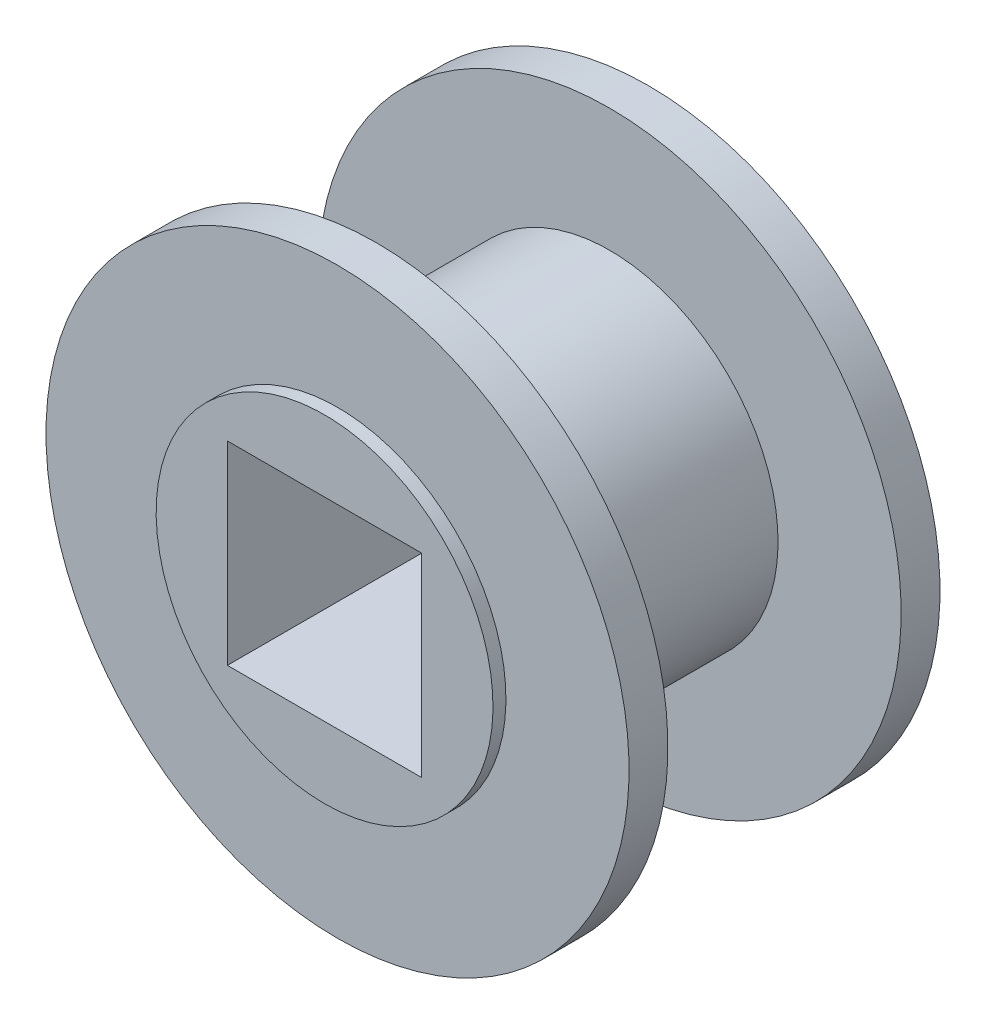
ISO-10303-21;
HEADER;
FILE_DESCRIPTION(('STEP AP214'),'2;1');
FILE_NAME('part.step','',(''),(''),'','','');
FILE_SCHEMA(('AUTOMOTIVE_DESIGN { 1 0 10303 214 1 1 1 1 }'));
ENDSEC;
DATA;
#1=APPLICATION_CONTEXT('core data for automotive mechanical design processes');
#2=APPLICATION_PROTOCOL_DEFINITION('international standard','automotive_design',2000,#1);
#3=PRODUCT_CONTEXT('',#1,'mechanical');
#4=PRODUCT('Part','Part','',(#3));
#5=PRODUCT_RELATED_PRODUCT_CATEGORY('part','',(#4));
#6=PRODUCT_DEFINITION_FORMATION('','',#4);
#7=PRODUCT_DEFINITION_CONTEXT('part definition',#1,'design');
#8=PRODUCT_DEFINITION('design','',#6,#7);
#9=PRODUCT_DEFINITION_SHAPE('','',#8);
#10=(LENGTH_UNIT() NAMED_UNIT(*) SI_UNIT(.MILLI.,.METRE.));
#11=(NAMED_UNIT(*) PLANE_ANGLE_UNIT() SI_UNIT($,.RADIAN.));
#12=(NAMED_UNIT(*) SI_UNIT($,.STERADIAN.) SOLID_ANGLE_UNIT());
#13=UNCERTAINTY_MEASURE_WITH_UNIT(LENGTH_MEASURE(1.E-05),#10,'distance_accuracy_value','');
#14=(GEOMETRIC_REPRESENTATION_CONTEXT(3) GLOBAL_UNCERTAINTY_ASSIGNED_CONTEXT((#13)) GLOBAL_UNIT_ASSIGNED_CONTEXT((#10,
#11,#12)) REPRESENTATION_CONTEXT('',''));
#15=CARTESIAN_POINT('',(0.,0.,0.));
#16=DIRECTION('',(0.,0.,1.));
#17=DIRECTION('',(1.,0.,0.));
#18=AXIS2_PLACEMENT_3D('',#15,#16,#17);
#19=CARTESIAN_POINT('',(0.,0.,13.));
#20=DIRECTION('',(0.,0.,-1.));
#21=DIRECTION('',(0.,1.,0.));
#22=AXIS2_PLACEMENT_3D('',#19,#20,#21);
#23=PLANE('',#22);
#24=DIRECTION('',(-1.,0.,0.));
#25=VECTOR('',#24,1.);
#26=CARTESIAN_POINT('',(-7.5,7.5,13.));
#27=LINE('',#26,#25);
#28=CARTESIAN_POINT('',(7.5,7.5,13.));
#29=VERTEX_POINT('',#28);
#30=CARTESIAN_POINT('',(-7.5,7.5,13.));
#31=VERTEX_POINT('',#30);
#32=EDGE_CURVE('E121',#29,#31,#27,.T.);
#33=ORIENTED_EDGE('',*,*,#32,.F.);
#34=DIRECTION('',(0.,1.,0.));
#35=VECTOR('',#34,1.);
#36=CARTESIAN_POINT('',(7.5,-7.5,13.));
#37=LINE('',#36,#35);
#38=CARTESIAN_POINT('',(7.5,-7.5,13.));
#39=VERTEX_POINT('',#38);
#40=EDGE_CURVE('E53',#39,#29,#37,.T.);
#41=ORIENTED_EDGE('',*,*,#40,.F.);
#42=DIRECTION('',(1.,0.,0.));
#43=VECTOR('',#42,1.);
#44=CARTESIAN_POINT('',(-7.5,-7.5,13.));
#45=LINE('',#44,#43);
#46=CARTESIAN_POINT('',(-7.5,-7.5,13.));
#47=VERTEX_POINT('',#46);
#48=EDGE_CURVE('E100',#47,#39,#45,.T.);
#49=ORIENTED_EDGE('',*,*,#48,.F.);
#50=DIRECTION('',(0.,-1.,0.));
#51=VECTOR('',#50,1.);
#52=CARTESIAN_POINT('',(-7.5,-7.5,13.));
#53=LINE('',#52,#51);
#54=EDGE_CURVE('E104',#31,#47,#53,.T.);
#55=ORIENTED_EDGE('',*,*,#54,.F.);
#56=EDGE_LOOP('',(#33,#41,#49,#55));
#57=FACE_BOUND('',#56,.T.);
#58=CARTESIAN_POINT('',(0.,0.,13.));
#59=DIRECTION('',(0.,0.,1.));
#60=DIRECTION('',(0.,-1.,0.));
#61=AXIS2_PLACEMENT_3D('',#58,#59,#60);
#62=CIRCLE('',#61,13.);
#63=CARTESIAN_POINT('',(0.,-13.,13.));
#64=VERTEX_POINT('',#63);
#65=EDGE_CURVE('E11',#64,#64,#62,.T.);
#66=ORIENTED_EDGE('',*,*,#65,.T.);
#67=EDGE_LOOP('',(#66));
#68=FACE_BOUND('',#67,.T.);
#69=ADVANCED_FACE('F38',(#57,#68),#23,.F.);
#70=CARTESIAN_POINT('',(0.,0.,19.5817610062893));
#71=DIRECTION('',(0.,0.,1.));
#72=DIRECTION('',(0.,-1.,0.));
#73=AXIS2_PLACEMENT_3D('',#70,#71,#72);
#74=CYLINDRICAL_SURFACE('',#73,13.);
#75=ORIENTED_EDGE('',*,*,#65,.F.);
#76=EDGE_LOOP('',(#75));
#77=FACE_BOUND('',#76,.T.);
#78=CARTESIAN_POINT('',(0.,0.,12.));
#79=DIRECTION('',(0.,0.,1.));
#80=DIRECTION('',(0.,-1.,0.));
#81=AXIS2_PLACEMENT_3D('',#78,#79,#80);
#82=CIRCLE('',#81,13.);
#83=CARTESIAN_POINT('',(0.,-13.,12.));
#84=VERTEX_POINT('',#83);
#85=EDGE_CURVE('E46',#84,#84,#82,.T.);
#86=ORIENTED_EDGE('',*,*,#85,.T.);
#87=EDGE_LOOP('',(#86));
#88=FACE_BOUND('',#87,.T.);
#89=ADVANCED_FACE('F170',(#77,#88),#74,.T.);
#90=CARTESIAN_POINT('',(0.,13.,12.));
#91=DIRECTION('',(0.,0.,-1.));
#92=DIRECTION('',(0.,1.,0.));
#93=AXIS2_PLACEMENT_3D('',#90,#91,#92);
#94=PLANE('',#93);
#95=ORIENTED_EDGE('',*,*,#85,.F.);
#96=EDGE_LOOP('',(#95));
#97=FACE_BOUND('',#96,.T.);
#98=CARTESIAN_POINT('',(0.,0.,12.));
#99=DIRECTION('',(0.,0.,1.));
#100=DIRECTION('',(0.,-1.,0.));
#101=AXIS2_PLACEMENT_3D('',#98,#99,#100);
#102=CIRCLE('',#101,22.5);
#103=CARTESIAN_POINT('',(0.,-22.5,12.));
#104=VERTEX_POINT('',#103);
#105=EDGE_CURVE('E163',#104,#104,#102,.T.);
#106=ORIENTED_EDGE('',*,*,#105,.T.);
#107=EDGE_LOOP('',(#106));
#108=FACE_BOUND('',#107,.T.);
#109=ADVANCED_FACE('F172',(#97,#108),#94,.F.);
#110=CARTESIAN_POINT('',(0.,0.,19.5817610062893));
#111=DIRECTION('',(0.,0.,1.));
#112=DIRECTION('',(0.,-1.,0.));
#113=AXIS2_PLACEMENT_3D('',#110,#111,#112);
#114=CYLINDRICAL_SURFACE('',#113,22.5);
#115=ORIENTED_EDGE('',*,*,#105,.F.);
#116=EDGE_LOOP('',(#115));
#117=FACE_BOUND('',#116,.T.);
#118=CARTESIAN_POINT('',(0.,0.,9.));
#119=DIRECTION('',(0.,0.,1.));
#120=DIRECTION('',(0.,-1.,0.));
#121=AXIS2_PLACEMENT_3D('',#118,#119,#120);
#122=CIRCLE('',#121,22.5);
#123=CARTESIAN_POINT('',(0.,-22.5,8.99999999999999));
#124=VERTEX_POINT('',#123);
#125=EDGE_CURVE('E159',#124,#124,#122,.T.);
#126=ORIENTED_EDGE('',*,*,#125,.T.);
#127=EDGE_LOOP('',(#126));
#128=FACE_BOUND('',#127,.T.);
#129=ADVANCED_FACE('F175',(#117,#128),#114,.T.);
#130=CARTESIAN_POINT('',(0.,22.5,9.));
#131=DIRECTION('',(0.,0.,1.));
#132=DIRECTION('',(0.,-1.,0.));
#133=AXIS2_PLACEMENT_3D('',#130,#131,#132);
#134=PLANE('',#133);
#135=ORIENTED_EDGE('',*,*,#125,.F.);
#136=EDGE_LOOP('',(#135));
#137=FACE_BOUND('',#136,.T.);
#138=CARTESIAN_POINT('',(0.,0.,9.));
#139=DIRECTION('',(0.,0.,1.));
#140=DIRECTION('',(0.,-1.,0.));
#141=AXIS2_PLACEMENT_3D('',#138,#139,#140);
#142=CIRCLE('',#141,13.);
#143=CARTESIAN_POINT('',(0.,-13.,9.));
#144=VERTEX_POINT('',#143);
#145=EDGE_CURVE('E155',#144,#144,#142,.T.);
#146=ORIENTED_EDGE('',*,*,#145,.T.);
#147=EDGE_LOOP('',(#146));
#148=FACE_BOUND('',#147,.T.);
#149=ADVANCED_FACE('F181',(#137,#148),#134,.F.);
#150=CARTESIAN_POINT('',(0.,0.,19.5817610062893));
#151=DIRECTION('',(0.,0.,1.));
#152=DIRECTION('',(0.,-1.,0.));
#153=AXIS2_PLACEMENT_3D('',#150,#151,#152);
#154=CYLINDRICAL_SURFACE('',#153,13.);
#155=CARTESIAN_POINT('',(-13.,0.,-8.5));
#156=CARTESIAN_POINT('',(-12.9999989044515,-0.0839563147427421,-8.49999640316709));
#157=CARTESIAN_POINT('',(-12.999178081572,-0.167966345196187,-8.49292758496519));
#158=CARTESIAN_POINT('',(-12.995982599614,-0.333652235419372,-8.46483826496662));
#159=CARTESIAN_POINT('',(-12.9936062813601,-0.415325505475653,-8.44380286531638));
#160=CARTESIAN_POINT('',(-12.9875677351869,-0.573914972249221,-8.38840533385724));
#161=CARTESIAN_POINT('',(-12.9839063366207,-0.650834199520699,-8.35405179569065));
#162=CARTESIAN_POINT('',(-12.9757057473599,-0.79779979378714,-8.27301111812132));
#163=CARTESIAN_POINT('',(-12.9711667170809,-0.867847413269117,-8.22632623210123));
#164=CARTESIAN_POINT('',(-12.9616943551208,-0.999427807179226,-8.12171196440117));
#165=CARTESIAN_POINT('',(-12.9567594432832,-1.06092347729183,-8.06373605262275));
#166=CARTESIAN_POINT('',(-12.9470643855765,-1.17333502414497,-7.93828516324756));
#167=CARTESIAN_POINT('',(-12.9423042482743,-1.2242503828419,-7.87080972079665));
#168=CARTESIAN_POINT('',(-12.9334819604022,-1.3141916873334,-7.72803733610484));
#169=CARTESIAN_POINT('',(-12.9294218388056,-1.3531833171573,-7.65271863992229));
#170=CARTESIAN_POINT('',(-12.9224797052987,-1.41795120910938,-7.49654783804118));
#171=CARTESIAN_POINT('',(-12.9195976551562,-1.44372790011126,-7.41569591201296));
#172=CARTESIAN_POINT('',(-12.9153528047108,-1.48122247723766,-7.25113647537628));
#173=CARTESIAN_POINT('',(-12.9139832786549,-1.49300261981048,-7.1674433262594));
#174=CARTESIAN_POINT('',(-12.9128978570991,-1.50236226854616,-6.99925756045587));
#175=CARTESIAN_POINT('',(-12.9131819045903,-1.49994226427626,-6.91476497143115));
#176=CARTESIAN_POINT('',(-12.9153653842397,-1.48102150197295,-6.7478106867289));
#177=CARTESIAN_POINT('',(-12.9172569773873,-1.46458907258954,-6.6653411304074));
#178=CARTESIAN_POINT('',(-12.9224301836669,-1.41821640637187,-6.50433810598175));
#179=CARTESIAN_POINT('',(-12.9257118211342,-1.38827593305336,-6.42580470681433));
#180=CARTESIAN_POINT('',(-12.9333043079058,-1.31566282618376,-6.2746895307639));
#181=CARTESIAN_POINT('',(-12.9376175732259,-1.27296024500285,-6.20212227049772));
#182=CARTESIAN_POINT('',(-12.9467853893456,-1.17605655290097,-6.06515827049275));
#183=CARTESIAN_POINT('',(-12.9516399612475,-1.12185499363063,-6.00076184949449));
#184=CARTESIAN_POINT('',(-12.9613782949516,-1.0031120359915,-5.88157071619168));
#185=CARTESIAN_POINT('',(-12.9662620604919,-0.938511694342139,-5.82683470870206));
#186=CARTESIAN_POINT('',(-12.9754816969276,-0.801008592236029,-5.72897438783242));
#187=CARTESIAN_POINT('',(-12.9798175668567,-0.728105817136098,-5.68585009493268));
#188=CARTESIAN_POINT('',(-12.9874550212078,-0.57602390567987,-5.61243828715518));
#189=CARTESIAN_POINT('',(-12.9907563324875,-0.496843118716625,-5.58215416157141));
#190=CARTESIAN_POINT('',(-12.9959501177405,-0.334473831095742,-5.5353274726576));
#191=CARTESIAN_POINT('',(-12.9978426478647,-0.251285490311374,-5.51878436163703));
#192=CARTESIAN_POINT('',(-12.999998373659,-0.0837704200050164,-5.49998472362037));
#193=CARTESIAN_POINT('',(-13.0002707984128,0.0005471135432015,-5.49764727106811));
#194=CARTESIAN_POINT('',(-12.9991804669134,0.168372695685007,-5.50711215461104));
#195=CARTESIAN_POINT('',(-12.9978177402298,0.251880758889224,-5.51891423501223));
#196=CARTESIAN_POINT('',(-12.993616027243,0.415480266956157,-5.556255972808));
#197=CARTESIAN_POINT('',(-12.9907811576039,0.495580568872891,-5.58175732870876));
#198=CARTESIAN_POINT('',(-12.9839527929212,0.650367161714355,-5.64573409622904));
#199=CARTESIAN_POINT('',(-12.9799592639147,0.725053293857113,-5.68420988816443));
#200=CARTESIAN_POINT('',(-12.9712363785455,0.867254744569763,-5.77324114512289));
#201=CARTESIAN_POINT('',(-12.9665038451426,0.934736878832463,-5.82384929591281));
#202=CARTESIAN_POINT('',(-12.9568430886348,1.06027784673838,-5.93563374481516));
#203=CARTESIAN_POINT('',(-12.9519148589511,1.11833636324618,-5.99681039844914));
#204=CARTESIAN_POINT('',(-12.9423899602444,1.22366664140003,-6.12835038533593));
#205=CARTESIAN_POINT('',(-12.9377950067669,1.27088497439797,-6.19875664350889));
#206=CARTESIAN_POINT('',(-12.9294843210235,1.35282617315314,-6.34654757584497));
#207=CARTESIAN_POINT('',(-12.9257685733744,1.38754925754463,-6.42393212787651));
#208=CARTESIAN_POINT('',(-12.9196483466479,1.44342658284102,-6.58330615373548));
#209=CARTESIAN_POINT('',(-12.91724089246,1.46461162925533,-6.66528470793035));
#210=CARTESIAN_POINT('',(-12.9140010380224,1.49291104062265,-6.83166493951436));
#211=CARTESIAN_POINT('',(-12.9131685761468,1.50002595610949,-6.91606652196452));
#212=CARTESIAN_POINT('',(-12.9131745631781,1.49997405326829,-7.08436565375942));
#213=CARTESIAN_POINT('',(-12.9140031925958,1.49289116482699,-7.16826324181099));
#214=CARTESIAN_POINT('',(-12.9172169582806,1.46482172327171,-7.33366750199321));
#215=CARTESIAN_POINT('',(-12.9196020954323,1.44383516225563,-7.41517417276497));
#216=CARTESIAN_POINT('',(-12.9256572251488,1.38857911797313,-7.57347609168934));
#217=CARTESIAN_POINT('',(-12.9293268880955,1.35431304208042,-7.65027254258118));
#218=CARTESIAN_POINT('',(-12.9375381901497,1.27347900341466,-7.79703840038788));
#219=CARTESIAN_POINT('',(-12.9420798337501,1.22691097725304,-7.86700777212214));
#220=CARTESIAN_POINT('',(-12.9515555600008,1.12248173071088,-7.99856295332931));
#221=CARTESIAN_POINT('',(-12.9564917239034,1.06455790771248,-8.06009892117498));
#222=CARTESIAN_POINT('',(-12.9661816355574,0.939190054186289,-8.17261111489076));
#223=CARTESIAN_POINT('',(-12.9709353397599,0.871743768617548,-8.22358483240876));
#224=CARTESIAN_POINT('',(-12.9797415177439,0.728996893197091,-8.31366356407028));
#225=CARTESIAN_POINT('',(-12.9837916526637,0.653671391511421,-8.35272930568544));
#226=CARTESIAN_POINT('',(-12.9907101076695,0.497527270565882,-8.41760310503945));
#227=CARTESIAN_POINT('',(-12.993579731148,0.416714824913398,-8.44342579213557));
#228=CARTESIAN_POINT('',(-12.9971099824635,0.279556305332048,-8.47479285483811));
#229=CARTESIAN_POINT('',(-12.9981885527758,0.22408031967996,-8.48423222713368));
#230=CARTESIAN_POINT('',(-12.9996339262189,0.112410914672187,-8.49683698528068));
#231=CARTESIAN_POINT('',(-13.0000007335839,0.0562174995863219,-8.50000240845436));
#232=CARTESIAN_POINT('',(-13.,0.,-8.5));
#233=B_SPLINE_CURVE_WITH_KNOTS('',3,(#155,#156,#157,#158,#159,#160,#161,#162,#163,#164,#165,
#166,#167,#168,#169,#170,#171,#172,#173,#174,#175,#176,#177,#178,#179,#180,#181,#182,#183,#184,
#185,#186,#187,#188,#189,#190,#191,#192,#193,#194,#195,#196,#197,#198,#199,#200,#201,#202,#203,
#204,#205,#206,#207,#208,#209,#210,#211,#212,#213,#214,#215,#216,#217,#218,#219,#220,#221,#222,
#223,#224,#225,#226,#227,#228,#229,#230,#231,#232),.UNSPECIFIED.,.T.,.F.,(4,2,2,2,2,2,2,2,2,2,2,
2,2,2,2,2,2,2,2,2,2,2,2,2,2,2,2,2,2,2,2,2,2,2,2,2,2,2,4),(0.,0.251663624421978,
0.503596125244171,0.755366334321089,1.00709056767771,1.25987498270023,1.51267177188699,
1.76618939688668,2.0196987937799,2.27207631201581,2.52444512928255,2.77559031440111,
3.02673989646913,3.27848351780672,3.53023695652505,3.78347119880911,4.0367058877347,
4.29000737900445,4.54329877367693,4.79514587715501,5.04698842639316,5.29813049175019,
5.54927991940194,5.80154039645154,6.05380936112788,6.30729621090899,6.56077862511548,
6.81368217226278,7.0665758236448,7.31797891068329,7.56938214060554,7.82072090595902,
8.07206096641734,8.32482769676521,8.57765438622356,8.83130609524227,9.08467699305618,
9.2531930112789,9.42170802703664),.UNSPECIFIED.);
#234=CARTESIAN_POINT('',(-13.,0.,-8.5));
#235=VERTEX_POINT('',#234);
#236=EDGE_CURVE('E107',#235,#235,#233,.T.);
#237=ORIENTED_EDGE('',*,*,#236,.F.);
#238=EDGE_LOOP('',(#237));
#239=FACE_BOUND('',#238,.T.);
#240=ORIENTED_EDGE('',*,*,#145,.F.);
#241=EDGE_LOOP('',(#240));
#242=FACE_BOUND('',#241,.T.);
#243=CARTESIAN_POINT('',(0.,0.,-9.));
#244=DIRECTION('',(0.,0.,1.));
#245=DIRECTION('',(0.,-1.,0.));
#246=AXIS2_PLACEMENT_3D('',#243,#244,#245);
#247=CIRCLE('',#246,13.);
#248=CARTESIAN_POINT('',(0.,-13.,-9.));
#249=VERTEX_POINT('',#248);
#250=EDGE_CURVE('E151',#249,#249,#247,.T.);
#251=ORIENTED_EDGE('',*,*,#250,.T.);
#252=EDGE_LOOP('',(#251));
#253=FACE_BOUND('',#252,.T.);
#254=ADVANCED_FACE('F187',(#239,#242,#253),#154,.T.);
#255=CARTESIAN_POINT('',(0.,13.,-9.));
#256=DIRECTION('',(0.,0.,-1.));
#257=DIRECTION('',(0.,1.,0.));
#258=AXIS2_PLACEMENT_3D('',#255,#256,#257);
#259=PLANE('',#258);
#260=ORIENTED_EDGE('',*,*,#250,.F.);
#261=EDGE_LOOP('',(#260));
#262=FACE_BOUND('',#261,.T.);
#263=CARTESIAN_POINT('',(0.,0.,-9.00000000000001));
#264=DIRECTION('',(0.,0.,1.));
#265=DIRECTION('',(0.,-1.,0.));
#266=AXIS2_PLACEMENT_3D('',#263,#264,#265);
#267=CIRCLE('',#266,22.5);
#268=CARTESIAN_POINT('',(0.,-22.5,-9.00000000000001));
#269=VERTEX_POINT('',#268);
#270=EDGE_CURVE('E147',#269,#269,#267,.T.);
#271=ORIENTED_EDGE('',*,*,#270,.T.);
#272=EDGE_LOOP('',(#271));
#273=FACE_BOUND('',#272,.T.);
#274=ADVANCED_FACE('F193',(#262,#273),#259,.F.);
#275=CARTESIAN_POINT('',(0.,0.,19.5817610062893));
#276=DIRECTION('',(0.,0.,1.));
#277=DIRECTION('',(0.,-1.,0.));
#278=AXIS2_PLACEMENT_3D('',#275,#276,#277);
#279=CYLINDRICAL_SURFACE('',#278,22.5);
#280=ORIENTED_EDGE('',*,*,#270,.F.);
#281=EDGE_LOOP('',(#280));
#282=FACE_BOUND('',#281,.T.);
#283=CARTESIAN_POINT('',(0.,0.,-12.));
#284=DIRECTION('',(0.,0.,1.));
#285=DIRECTION('',(0.,-1.,0.));
#286=AXIS2_PLACEMENT_3D('',#283,#284,#285);
#287=CIRCLE('',#286,22.5);
#288=CARTESIAN_POINT('',(0.,-22.5,-12.));
#289=VERTEX_POINT('',#288);
#290=EDGE_CURVE('E143',#289,#289,#287,.T.);
#291=ORIENTED_EDGE('',*,*,#290,.T.);
#292=EDGE_LOOP('',(#291));
#293=FACE_BOUND('',#292,.T.);
#294=ADVANCED_FACE('F200',(#282,#293),#279,.T.);
#295=CARTESIAN_POINT('',(0.,22.5,-12.));
#296=DIRECTION('',(0.,0.,1.));
#297=DIRECTION('',(0.,-1.,0.));
#298=AXIS2_PLACEMENT_3D('',#295,#296,#297);
#299=PLANE('',#298);
#300=ORIENTED_EDGE('',*,*,#290,.F.);
#301=EDGE_LOOP('',(#300));
#302=FACE_BOUND('',#301,.T.);
#303=CARTESIAN_POINT('',(0.,0.,-12.));
#304=DIRECTION('',(0.,0.,1.));
#305=DIRECTION('',(0.,-1.,0.));
#306=AXIS2_PLACEMENT_3D('',#303,#304,#305);
#307=CIRCLE('',#306,13.);
#308=CARTESIAN_POINT('',(0.,-13.,-12.));
#309=VERTEX_POINT('',#308);
#310=EDGE_CURVE('E139',#309,#309,#307,.T.);
#311=ORIENTED_EDGE('',*,*,#310,.T.);
#312=EDGE_LOOP('',(#311));
#313=FACE_BOUND('',#312,.T.);
#314=ADVANCED_FACE('F206',(#302,#313),#299,.F.);
#315=CARTESIAN_POINT('',(0.,0.,19.5817610062893));
#316=DIRECTION('',(0.,0.,1.));
#317=DIRECTION('',(0.,-1.,0.));
#318=AXIS2_PLACEMENT_3D('',#315,#316,#317);
#319=CYLINDRICAL_SURFACE('',#318,13.);
#320=ORIENTED_EDGE('',*,*,#310,.F.);
#321=EDGE_LOOP('',(#320));
#322=FACE_BOUND('',#321,.T.);
#323=CARTESIAN_POINT('',(0.,0.,-13.));
#324=DIRECTION('',(0.,0.,1.));
#325=DIRECTION('',(0.,-1.,0.));
#326=AXIS2_PLACEMENT_3D('',#323,#324,#325);
#327=CIRCLE('',#326,13.);
#328=CARTESIAN_POINT('',(0.,-13.,-13.));
#329=VERTEX_POINT('',#328);
#330=EDGE_CURVE('E130',#329,#329,#327,.T.);
#331=ORIENTED_EDGE('',*,*,#330,.T.);
#332=EDGE_LOOP('',(#331));
#333=FACE_BOUND('',#332,.T.);
#334=ADVANCED_FACE('F212',(#322,#333),#319,.T.);
#335=CARTESIAN_POINT('',(0.,13.,-13.));
#336=DIRECTION('',(0.,0.,1.));
#337=DIRECTION('',(0.,-1.,0.));
#338=AXIS2_PLACEMENT_3D('',#335,#336,#337);
#339=PLANE('',#338);
#340=DIRECTION('',(1.,0.,0.));
#341=VECTOR('',#340,1.);
#342=CARTESIAN_POINT('',(-7.5,-7.5,-13.));
#343=LINE('',#342,#341);
#344=CARTESIAN_POINT('',(-7.5,-7.5,-13.));
#345=VERTEX_POINT('',#344);
#346=CARTESIAN_POINT('',(7.5,-7.5,-13.));
#347=VERTEX_POINT('',#346);
#348=EDGE_CURVE('E88',#345,#347,#343,.T.);
#349=ORIENTED_EDGE('',*,*,#348,.T.);
#350=DIRECTION('',(0.,1.,0.));
#351=VECTOR('',#350,1.);
#352=CARTESIAN_POINT('',(7.5,-7.5,-13.));
#353=LINE('',#352,#351);
#354=CARTESIAN_POINT('',(7.5,7.5,-13.));
#355=VERTEX_POINT('',#354);
#356=EDGE_CURVE('E81',#347,#355,#353,.T.);
#357=ORIENTED_EDGE('',*,*,#356,.T.);
#358=DIRECTION('',(-1.,0.,0.));
#359=VECTOR('',#358,1.);
#360=CARTESIAN_POINT('',(-7.5,7.5,-13.));
#361=LINE('',#360,#359);
#362=CARTESIAN_POINT('',(-7.5,7.5,-13.));
#363=VERTEX_POINT('',#362);
#364=EDGE_CURVE('E91',#355,#363,#361,.T.);
#365=ORIENTED_EDGE('',*,*,#364,.T.);
#366=DIRECTION('',(0.,-1.,0.));
#367=VECTOR('',#366,1.);
#368=CARTESIAN_POINT('',(-7.5,-7.5,-13.));
#369=LINE('',#368,#367);
#370=EDGE_CURVE('E61',#363,#345,#369,.T.);
#371=ORIENTED_EDGE('',*,*,#370,.T.);
#372=EDGE_LOOP('',(#349,#357,#365,#371));
#373=FACE_BOUND('',#372,.T.);
#374=ORIENTED_EDGE('',*,*,#330,.F.);
#375=EDGE_LOOP('',(#374));
#376=FACE_BOUND('',#375,.T.);
#377=ADVANCED_FACE('F96',(#373,#376),#339,.F.);
#378=CARTESIAN_POINT('',(7.5,-7.5,-13.));
#379=DIRECTION('',(1.,0.,0.));
#380=DIRECTION('',(0.,0.,-1.));
#381=AXIS2_PLACEMENT_3D('',#378,#379,#380);
#382=PLANE('',#381);
#383=ORIENTED_EDGE('',*,*,#40,.T.);
#384=DIRECTION('',(0.,0.,1.));
#385=VECTOR('',#384,1.);
#386=CARTESIAN_POINT('',(7.5,7.5,-13.));
#387=LINE('',#386,#385);
#388=EDGE_CURVE('E77',#355,#29,#387,.T.);
#389=ORIENTED_EDGE('',*,*,#388,.F.);
#390=ORIENTED_EDGE('',*,*,#356,.F.);
#391=DIRECTION('',(0.,0.,1.));
#392=VECTOR('',#391,1.);
#393=CARTESIAN_POINT('',(7.5,-7.5,-13.));
#394=LINE('',#393,#392);
#395=EDGE_CURVE('E127',#347,#39,#394,.T.);
#396=ORIENTED_EDGE('',*,*,#395,.T.);
#397=EDGE_LOOP('',(#383,#389,#390,#396));
#398=FACE_BOUND('',#397,.T.);
#399=ADVANCED_FACE('F79',(#398),#382,.F.);
#400=CARTESIAN_POINT('',(-7.5,-7.5,-13.));
#401=DIRECTION('',(0.,-1.,0.));
#402=DIRECTION('',(0.,0.,-1.));
#403=AXIS2_PLACEMENT_3D('',#400,#401,#402);
#404=PLANE('',#403);
#405=ORIENTED_EDGE('',*,*,#48,.T.);
#406=ORIENTED_EDGE('',*,*,#395,.F.);
#407=ORIENTED_EDGE('',*,*,#348,.F.);
#408=DIRECTION('',(0.,0.,1.));
#409=VECTOR('',#408,1.);
#410=CARTESIAN_POINT('',(-7.5,-7.5,-13.));
#411=LINE('',#410,#409);
#412=EDGE_CURVE('E131',#345,#47,#411,.T.);
#413=ORIENTED_EDGE('',*,*,#412,.T.);
#414=EDGE_LOOP('',(#405,#406,#407,#413));
#415=FACE_BOUND('',#414,.T.);
#416=ADVANCED_FACE('F225',(#415),#404,.F.);
#417=CARTESIAN_POINT('',(-7.5,-7.5,-13.));
#418=DIRECTION('',(-1.,0.,0.));
#419=DIRECTION('',(0.,0.,1.));
#420=AXIS2_PLACEMENT_3D('',#417,#418,#419);
#421=PLANE('',#420);
#422=CARTESIAN_POINT('',(-7.5,0.,-7.));
#423=DIRECTION('',(-1.,0.,0.));
#424=DIRECTION('',(0.,0.,1.));
#425=AXIS2_PLACEMENT_3D('',#422,#423,#424);
#426=CIRCLE('',#425,1.5);
#427=CARTESIAN_POINT('',(-7.5,0.,-5.5));
#428=VERTEX_POINT('',#427);
#429=EDGE_CURVE('E260',#428,#428,#426,.F.);
#430=ORIENTED_EDGE('',*,*,#429,.F.);
#431=EDGE_LOOP('',(#430));
#432=FACE_BOUND('',#431,.T.);
#433=ORIENTED_EDGE('',*,*,#54,.T.);
#434=ORIENTED_EDGE('',*,*,#412,.F.);
#435=ORIENTED_EDGE('',*,*,#370,.F.);
#436=DIRECTION('',(0.,0.,1.));
#437=VECTOR('',#436,1.);
#438=CARTESIAN_POINT('',(-7.5,7.5,-13.));
#439=LINE('',#438,#437);
#440=EDGE_CURVE('E87',#363,#31,#439,.T.);
#441=ORIENTED_EDGE('',*,*,#440,.T.);
#442=EDGE_LOOP('',(#433,#434,#435,#441));
#443=FACE_BOUND('',#442,.T.);
#444=ADVANCED_FACE('F237',(#432,#443),#421,.F.);
#445=CARTESIAN_POINT('',(-7.5,7.5,-13.));
#446=DIRECTION('',(0.,1.,0.));
#447=DIRECTION('',(0.,0.,1.));
#448=AXIS2_PLACEMENT_3D('',#445,#446,#447);
#449=PLANE('',#448);
#450=ORIENTED_EDGE('',*,*,#32,.T.);
#451=ORIENTED_EDGE('',*,*,#440,.F.);
#452=ORIENTED_EDGE('',*,*,#364,.F.);
#453=ORIENTED_EDGE('',*,*,#388,.T.);
#454=EDGE_LOOP('',(#450,#451,#452,#453));
#455=FACE_BOUND('',#454,.T.);
#456=ADVANCED_FACE('F92',(#455),#449,.F.);
#457=CARTESIAN_POINT('',(-22.501,0.,-7.));
#458=DIRECTION('',(1.,0.,0.));
#459=DIRECTION('',(0.,0.,-1.));
#460=AXIS2_PLACEMENT_3D('',#457,#458,#459);
#461=CYLINDRICAL_SURFACE('',#460,1.5);
#462=ORIENTED_EDGE('',*,*,#429,.T.);
#463=EDGE_LOOP('',(#462));
#464=FACE_BOUND('',#463,.T.);
#465=ORIENTED_EDGE('',*,*,#236,.T.);
#466=EDGE_LOOP('',(#465));
#467=FACE_BOUND('',#466,.T.);
#468=ADVANCED_FACE('F247',(#464,#467),#461,.F.);
#469=CLOSED_SHELL('',(#69,#89,#109,#129,#149,#254,#274,#294,#314,#334,#377,#399,#416,#444,#456,#468));
#470=MANIFOLD_SOLID_BREP('B2',#469);
#471=ADVANCED_BREP_SHAPE_REPRESENTATION('',(#18,#470),#14);
#472=SHAPE_DEFINITION_REPRESENTATION(#9,#471);
ENDSEC;
END-ISO-10303-21;
